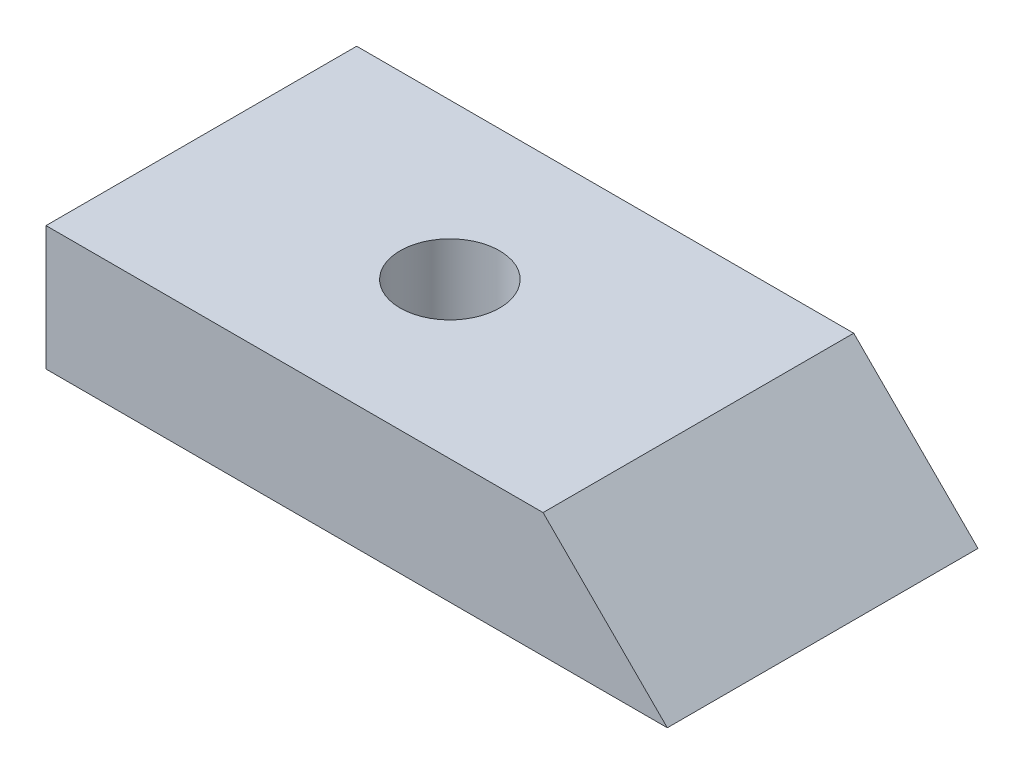
ISO-10303-21;
HEADER;
FILE_DESCRIPTION(('STEP AP214'),'2;1');
FILE_NAME('part.step','',(''),(''),'','','');
FILE_SCHEMA(('AUTOMOTIVE_DESIGN { 1 0 10303 214 1 1 1 1 }'));
ENDSEC;
DATA;
#1=APPLICATION_CONTEXT('core data for automotive mechanical design processes');
#2=APPLICATION_PROTOCOL_DEFINITION('international standard','automotive_design',2000,#1);
#3=PRODUCT_CONTEXT('',#1,'mechanical');
#4=PRODUCT('Part','Part','',(#3));
#5=PRODUCT_RELATED_PRODUCT_CATEGORY('part','',(#4));
#6=PRODUCT_DEFINITION_FORMATION('','',#4);
#7=PRODUCT_DEFINITION_CONTEXT('part definition',#1,'design');
#8=PRODUCT_DEFINITION('design','',#6,#7);
#9=PRODUCT_DEFINITION_SHAPE('','',#8);
#10=(LENGTH_UNIT() NAMED_UNIT(*) SI_UNIT(.MILLI.,.METRE.));
#11=(NAMED_UNIT(*) PLANE_ANGLE_UNIT() SI_UNIT($,.RADIAN.));
#12=(NAMED_UNIT(*) SI_UNIT($,.STERADIAN.) SOLID_ANGLE_UNIT());
#13=UNCERTAINTY_MEASURE_WITH_UNIT(LENGTH_MEASURE(1.E-05),#10,'distance_accuracy_value','');
#14=(GEOMETRIC_REPRESENTATION_CONTEXT(3) GLOBAL_UNCERTAINTY_ASSIGNED_CONTEXT((#13)) GLOBAL_UNIT_ASSIGNED_CONTEXT((#10,
#11,#12)) REPRESENTATION_CONTEXT('',''));
#15=CARTESIAN_POINT('',(0.,0.,0.));
#16=DIRECTION('',(0.,0.,1.));
#17=DIRECTION('',(1.,0.,0.));
#18=AXIS2_PLACEMENT_3D('',#15,#16,#17);
#19=CARTESIAN_POINT('',(25.,0.,12.5));
#20=DIRECTION('',(-0.707106781186546,-0.707106781186549,0.));
#21=DIRECTION('',(0.707106781186549,-0.707106781186546,0.));
#22=AXIS2_PLACEMENT_3D('',#19,#20,#21);
#23=PLANE('',#22);
#24=DIRECTION('',(-0.707106781186549,0.707106781186546,0.));
#25=VECTOR('',#24,1.);
#26=CARTESIAN_POINT('',(25.,0.,-12.5));
#27=LINE('',#26,#25);
#28=CARTESIAN_POINT('',(25.,0.,-12.5));
#29=VERTEX_POINT('',#28);
#30=CARTESIAN_POINT('',(15.,10.,-12.5));
#31=VERTEX_POINT('',#30);
#32=EDGE_CURVE('E99',#29,#31,#27,.T.);
#33=ORIENTED_EDGE('',*,*,#32,.T.);
#34=DIRECTION('',(0.,0.,-1.));
#35=VECTOR('',#34,1.);
#36=CARTESIAN_POINT('',(15.,10.,12.5));
#37=LINE('',#36,#35);
#38=CARTESIAN_POINT('',(15.,10.,12.5));
#39=VERTEX_POINT('',#38);
#40=EDGE_CURVE('E11',#39,#31,#37,.T.);
#41=ORIENTED_EDGE('',*,*,#40,.F.);
#42=DIRECTION('',(-0.707106781186549,0.707106781186546,0.));
#43=VECTOR('',#42,1.);
#44=CARTESIAN_POINT('',(25.,0.,12.5));
#45=LINE('',#44,#43);
#46=CARTESIAN_POINT('',(25.,0.,12.5));
#47=VERTEX_POINT('',#46);
#48=EDGE_CURVE('E84',#47,#39,#45,.T.);
#49=ORIENTED_EDGE('',*,*,#48,.F.);
#50=DIRECTION('',(0.,0.,-1.));
#51=VECTOR('',#50,1.);
#52=CARTESIAN_POINT('',(25.,0.,12.5));
#53=LINE('',#52,#51);
#54=EDGE_CURVE('E95',#47,#29,#53,.T.);
#55=ORIENTED_EDGE('',*,*,#54,.T.);
#56=EDGE_LOOP('',(#33,#41,#49,#55));
#57=FACE_BOUND('',#56,.T.);
#58=ADVANCED_FACE('F33',(#57),#23,.F.);
#59=CARTESIAN_POINT('',(-25.,10.,12.5));
#60=DIRECTION('',(0.,-1.,0.));
#61=DIRECTION('',(0.,0.,-1.));
#62=AXIS2_PLACEMENT_3D('',#59,#60,#61);
#63=PLANE('',#62);
#64=CARTESIAN_POINT('',(-4.99999999999988,10.,0.));
#65=DIRECTION('',(0.,1.,0.));
#66=DIRECTION('',(0.,0.,1.));
#67=AXIS2_PLACEMENT_3D('',#64,#65,#66);
#68=CIRCLE('',#67,4.);
#69=CARTESIAN_POINT('',(-4.99999999999988,10.,4.00000000000001));
#70=VERTEX_POINT('',#69);
#71=EDGE_CURVE('E110',#70,#70,#68,.T.);
#72=ORIENTED_EDGE('',*,*,#71,.F.);
#73=EDGE_LOOP('',(#72));
#74=FACE_BOUND('',#73,.T.);
#75=DIRECTION('',(-1.,0.,0.));
#76=VECTOR('',#75,1.);
#77=CARTESIAN_POINT('',(-25.,10.,-12.5));
#78=LINE('',#77,#76);
#79=CARTESIAN_POINT('',(-25.,10.,-12.5));
#80=VERTEX_POINT('',#79);
#81=EDGE_CURVE('E89',#31,#80,#78,.T.);
#82=ORIENTED_EDGE('',*,*,#81,.T.);
#83=DIRECTION('',(0.,0.,-1.));
#84=VECTOR('',#83,1.);
#85=CARTESIAN_POINT('',(-25.,10.,12.5));
#86=LINE('',#85,#84);
#87=CARTESIAN_POINT('',(-25.,10.,12.5));
#88=VERTEX_POINT('',#87);
#89=EDGE_CURVE('E42',#88,#80,#86,.T.);
#90=ORIENTED_EDGE('',*,*,#89,.F.);
#91=DIRECTION('',(-1.,0.,0.));
#92=VECTOR('',#91,1.);
#93=CARTESIAN_POINT('',(-25.,10.,12.5));
#94=LINE('',#93,#92);
#95=EDGE_CURVE('E78',#39,#88,#94,.T.);
#96=ORIENTED_EDGE('',*,*,#95,.F.);
#97=ORIENTED_EDGE('',*,*,#40,.T.);
#98=EDGE_LOOP('',(#82,#90,#96,#97));
#99=FACE_BOUND('',#98,.T.);
#100=ADVANCED_FACE('F88',(#74,#99),#63,.F.);
#101=CARTESIAN_POINT('',(-25.,0.,12.5));
#102=DIRECTION('',(1.,0.,0.));
#103=DIRECTION('',(0.,0.,-1.));
#104=AXIS2_PLACEMENT_3D('',#101,#102,#103);
#105=PLANE('',#104);
#106=DIRECTION('',(0.,-1.,0.));
#107=VECTOR('',#106,1.);
#108=CARTESIAN_POINT('',(-25.,0.,-12.5));
#109=LINE('',#108,#107);
#110=CARTESIAN_POINT('',(-25.,0.,-12.5));
#111=VERTEX_POINT('',#110);
#112=EDGE_CURVE('E103',#80,#111,#109,.T.);
#113=ORIENTED_EDGE('',*,*,#112,.T.);
#114=DIRECTION('',(0.,0.,-1.));
#115=VECTOR('',#114,1.);
#116=CARTESIAN_POINT('',(-25.,0.,12.5));
#117=LINE('',#116,#115);
#118=CARTESIAN_POINT('',(-25.,0.,12.5));
#119=VERTEX_POINT('',#118);
#120=EDGE_CURVE('E91',#119,#111,#117,.T.);
#121=ORIENTED_EDGE('',*,*,#120,.F.);
#122=DIRECTION('',(0.,-1.,0.));
#123=VECTOR('',#122,1.);
#124=CARTESIAN_POINT('',(-25.,0.,12.5));
#125=LINE('',#124,#123);
#126=EDGE_CURVE('E81',#88,#119,#125,.T.);
#127=ORIENTED_EDGE('',*,*,#126,.F.);
#128=ORIENTED_EDGE('',*,*,#89,.T.);
#129=EDGE_LOOP('',(#113,#121,#127,#128));
#130=FACE_BOUND('',#129,.T.);
#131=ADVANCED_FACE('F93',(#130),#105,.F.);
#132=CARTESIAN_POINT('',(15.,0.,12.5));
#133=DIRECTION('',(0.,1.,0.));
#134=DIRECTION('',(0.,0.,1.));
#135=AXIS2_PLACEMENT_3D('',#132,#133,#134);
#136=PLANE('',#135);
#137=CARTESIAN_POINT('',(-4.99999999999988,0.,0.));
#138=DIRECTION('',(0.,1.,0.));
#139=DIRECTION('',(0.,0.,1.));
#140=AXIS2_PLACEMENT_3D('',#137,#138,#139);
#141=CIRCLE('',#140,4.);
#142=CARTESIAN_POINT('',(-4.99999999999988,0.,4.00000000000001));
#143=VERTEX_POINT('',#142);
#144=EDGE_CURVE('E36',#143,#143,#141,.T.);
#145=ORIENTED_EDGE('',*,*,#144,.T.);
#146=EDGE_LOOP('',(#145));
#147=FACE_BOUND('',#146,.T.);
#148=DIRECTION('',(1.,0.,0.));
#149=VECTOR('',#148,1.);
#150=CARTESIAN_POINT('',(15.,0.,-12.5));
#151=LINE('',#150,#149);
#152=EDGE_CURVE('E67',#111,#29,#151,.T.);
#153=ORIENTED_EDGE('',*,*,#152,.T.);
#154=ORIENTED_EDGE('',*,*,#54,.F.);
#155=DIRECTION('',(1.,0.,0.));
#156=VECTOR('',#155,1.);
#157=CARTESIAN_POINT('',(-25.,0.,12.5));
#158=LINE('',#157,#156);
#159=EDGE_CURVE('E50',#119,#47,#158,.T.);
#160=ORIENTED_EDGE('',*,*,#159,.F.);
#161=ORIENTED_EDGE('',*,*,#120,.T.);
#162=EDGE_LOOP('',(#153,#154,#160,#161));
#163=FACE_BOUND('',#162,.T.);
#164=ADVANCED_FACE('F107',(#147,#163),#136,.F.);
#165=CARTESIAN_POINT('',(0.,0.,12.5));
#166=DIRECTION('',(0.,0.,-1.));
#167=DIRECTION('',(-1.,0.,0.));
#168=AXIS2_PLACEMENT_3D('',#165,#166,#167);
#169=PLANE('',#168);
#170=ORIENTED_EDGE('',*,*,#48,.T.);
#171=ORIENTED_EDGE('',*,*,#95,.T.);
#172=ORIENTED_EDGE('',*,*,#126,.T.);
#173=ORIENTED_EDGE('',*,*,#159,.T.);
#174=EDGE_LOOP('',(#170,#171,#172,#173));
#175=FACE_BOUND('',#174,.T.);
#176=ADVANCED_FACE('F79',(#175),#169,.F.);
#177=CARTESIAN_POINT('',(0.,0.,-12.5));
#178=DIRECTION('',(0.,0.,-1.));
#179=DIRECTION('',(-1.,0.,0.));
#180=AXIS2_PLACEMENT_3D('',#177,#178,#179);
#181=PLANE('',#180);
#182=ORIENTED_EDGE('',*,*,#32,.F.);
#183=ORIENTED_EDGE('',*,*,#152,.F.);
#184=ORIENTED_EDGE('',*,*,#112,.F.);
#185=ORIENTED_EDGE('',*,*,#81,.F.);
#186=EDGE_LOOP('',(#182,#183,#184,#185));
#187=FACE_BOUND('',#186,.T.);
#188=ADVANCED_FACE('F120',(#187),#181,.T.);
#189=CARTESIAN_POINT('',(-4.99999999999988,-15.,0.));
#190=DIRECTION('',(0.,1.,0.));
#191=DIRECTION('',(0.,0.,1.));
#192=AXIS2_PLACEMENT_3D('',#189,#190,#191);
#193=CYLINDRICAL_SURFACE('',#192,4.);
#194=ORIENTED_EDGE('',*,*,#71,.T.);
#195=EDGE_LOOP('',(#194));
#196=FACE_BOUND('',#195,.T.);
#197=ORIENTED_EDGE('',*,*,#144,.F.);
#198=EDGE_LOOP('',(#197));
#199=FACE_BOUND('',#198,.T.);
#200=ADVANCED_FACE('F118',(#196,#199),#193,.F.);
#201=CLOSED_SHELL('',(#58,#100,#131,#164,#176,#188,#200));
#202=MANIFOLD_SOLID_BREP('B2',#201);
#203=ADVANCED_BREP_SHAPE_REPRESENTATION('',(#18,#202),#14);
#204=SHAPE_DEFINITION_REPRESENTATION(#9,#203);
ENDSEC;
END-ISO-10303-21;
